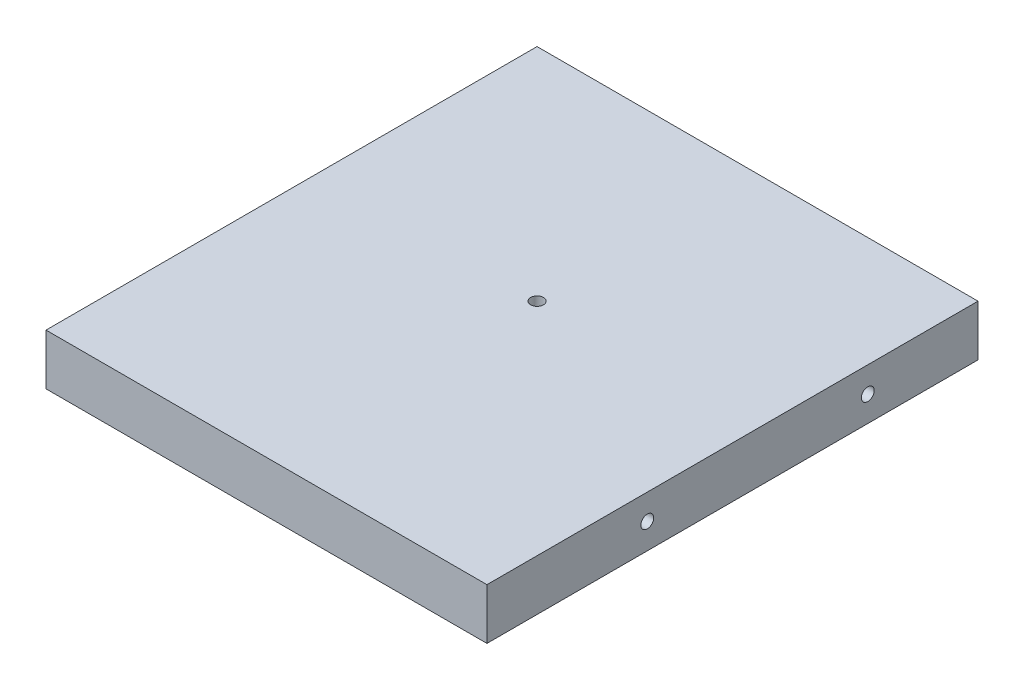
ISO-10303-21;
HEADER;
FILE_DESCRIPTION(('STEP AP214'),'2;1');
FILE_NAME('part.step','',(''),(''),'','','');
FILE_SCHEMA(('AUTOMOTIVE_DESIGN { 1 0 10303 214 1 1 1 1 }'));
ENDSEC;
DATA;
#1=APPLICATION_CONTEXT('core data for automotive mechanical design processes');
#2=APPLICATION_PROTOCOL_DEFINITION('international standard','automotive_design',2000,#1);
#3=PRODUCT_CONTEXT('',#1,'mechanical');
#4=PRODUCT('Part','Part','',(#3));
#5=PRODUCT_RELATED_PRODUCT_CATEGORY('part','',(#4));
#6=PRODUCT_DEFINITION_FORMATION('','',#4);
#7=PRODUCT_DEFINITION_CONTEXT('part definition',#1,'design');
#8=PRODUCT_DEFINITION('design','',#6,#7);
#9=PRODUCT_DEFINITION_SHAPE('','',#8);
#10=(LENGTH_UNIT() NAMED_UNIT(*) SI_UNIT(.MILLI.,.METRE.));
#11=(NAMED_UNIT(*) PLANE_ANGLE_UNIT() SI_UNIT($,.RADIAN.));
#12=(NAMED_UNIT(*) SI_UNIT($,.STERADIAN.) SOLID_ANGLE_UNIT());
#13=UNCERTAINTY_MEASURE_WITH_UNIT(LENGTH_MEASURE(1.E-05),#10,'distance_accuracy_value','');
#14=(GEOMETRIC_REPRESENTATION_CONTEXT(3) GLOBAL_UNCERTAINTY_ASSIGNED_CONTEXT((#13)) GLOBAL_UNIT_ASSIGNED_CONTEXT((#10,
#11,#12)) REPRESENTATION_CONTEXT('',''));
#15=CARTESIAN_POINT('',(0.,0.,0.));
#16=DIRECTION('',(0.,0.,1.));
#17=DIRECTION('',(1.,0.,0.));
#18=AXIS2_PLACEMENT_3D('',#15,#16,#17);
#19=CARTESIAN_POINT('',(61.7729043572606,25.4,-131.48104782137));
#20=DIRECTION('',(1.,0.,0.));
#21=DIRECTION('',(0.,0.,-1.));
#22=AXIS2_PLACEMENT_3D('',#19,#20,#21);
#23=PLANE('',#22);
#24=CARTESIAN_POINT('',(61.7729043572606,12.7,33.5189521786303));
#25=DIRECTION('',(-1.,0.,0.));
#26=DIRECTION('',(0.,0.,1.));
#27=AXIS2_PLACEMENT_3D('',#24,#25,#26);
#28=CIRCLE('',#27,3.2);
#29=CARTESIAN_POINT('',(61.7729043572606,12.7,36.7189521786303));
#30=VERTEX_POINT('',#29);
#31=EDGE_CURVE('E108',#30,#30,#28,.T.);
#32=ORIENTED_EDGE('',*,*,#31,.F.);
#33=EDGE_LOOP('',(#32));
#34=FACE_BOUND('',#33,.T.);
#35=CARTESIAN_POINT('',(61.7729043572606,12.7,-76.4810478213697));
#36=DIRECTION('',(-1.,0.,0.));
#37=DIRECTION('',(0.,0.,1.));
#38=AXIS2_PLACEMENT_3D('',#35,#36,#37);
#39=CIRCLE('',#38,3.2);
#40=CARTESIAN_POINT('',(61.7729043572606,12.7,-73.2810478213697));
#41=VERTEX_POINT('',#40);
#42=EDGE_CURVE('E114',#41,#41,#39,.T.);
#43=ORIENTED_EDGE('',*,*,#42,.F.);
#44=EDGE_LOOP('',(#43));
#45=FACE_BOUND('',#44,.T.);
#46=DIRECTION('',(0.,0.,1.));
#47=VECTOR('',#46,1.);
#48=CARTESIAN_POINT('',(61.7729043572606,0.,-131.48104782137));
#49=LINE('',#48,#47);
#50=CARTESIAN_POINT('',(61.7729043572606,0.,-131.48104782137));
#51=VERTEX_POINT('',#50);
#52=CARTESIAN_POINT('',(61.7729043572606,0.,113.51895217863));
#53=VERTEX_POINT('',#52);
#54=EDGE_CURVE('E77',#51,#53,#49,.T.);
#55=ORIENTED_EDGE('',*,*,#54,.T.);
#56=DIRECTION('',(0.,-1.,0.));
#57=VECTOR('',#56,1.);
#58=CARTESIAN_POINT('',(61.7729043572606,25.4,113.51895217863));
#59=LINE('',#58,#57);
#60=CARTESIAN_POINT('',(61.7729043572606,25.4,113.51895217863));
#61=VERTEX_POINT('',#60);
#62=EDGE_CURVE('E80',#61,#53,#59,.T.);
#63=ORIENTED_EDGE('',*,*,#62,.F.);
#64=DIRECTION('',(0.,0.,1.));
#65=VECTOR('',#64,1.);
#66=CARTESIAN_POINT('',(61.7729043572606,25.4,-131.48104782137));
#67=LINE('',#66,#65);
#68=CARTESIAN_POINT('',(61.7729043572606,25.4,-131.48104782137));
#69=VERTEX_POINT('',#68);
#70=EDGE_CURVE('E64',#69,#61,#67,.T.);
#71=ORIENTED_EDGE('',*,*,#70,.F.);
#72=DIRECTION('',(0.,-1.,0.));
#73=VECTOR('',#72,1.);
#74=CARTESIAN_POINT('',(61.7729043572606,25.4,-131.48104782137));
#75=LINE('',#74,#73);
#76=EDGE_CURVE('E40',#69,#51,#75,.T.);
#77=ORIENTED_EDGE('',*,*,#76,.T.);
#78=EDGE_LOOP('',(#55,#63,#71,#77));
#79=FACE_BOUND('',#78,.T.);
#80=ADVANCED_FACE('F32',(#34,#45,#79),#23,.F.);
#81=CARTESIAN_POINT('',(281.772904357261,25.4,-131.48104782137));
#82=DIRECTION('',(-1.,0.,0.));
#83=DIRECTION('',(0.,0.,1.));
#84=AXIS2_PLACEMENT_3D('',#81,#82,#83);
#85=PLANE('',#84);
#86=CARTESIAN_POINT('',(281.772904357261,12.7,-76.4810478213697));
#87=DIRECTION('',(1.,0.,0.));
#88=DIRECTION('',(0.,0.,-1.));
#89=AXIS2_PLACEMENT_3D('',#86,#87,#88);
#90=CIRCLE('',#89,3.2);
#91=CARTESIAN_POINT('',(281.772904357261,12.7,-79.6810478213697));
#92=VERTEX_POINT('',#91);
#93=EDGE_CURVE('E98',#92,#92,#90,.T.);
#94=ORIENTED_EDGE('',*,*,#93,.F.);
#95=EDGE_LOOP('',(#94));
#96=FACE_BOUND('',#95,.T.);
#97=CARTESIAN_POINT('',(281.772904357261,12.7,33.5189521786303));
#98=DIRECTION('',(1.,0.,0.));
#99=DIRECTION('',(0.,0.,-1.));
#100=AXIS2_PLACEMENT_3D('',#97,#98,#99);
#101=CIRCLE('',#100,3.2);
#102=CARTESIAN_POINT('',(281.772904357261,12.7,30.3189521786303));
#103=VERTEX_POINT('',#102);
#104=EDGE_CURVE('E102',#103,#103,#101,.T.);
#105=ORIENTED_EDGE('',*,*,#104,.F.);
#106=EDGE_LOOP('',(#105));
#107=FACE_BOUND('',#106,.T.);
#108=DIRECTION('',(0.,0.,-1.));
#109=VECTOR('',#108,1.);
#110=CARTESIAN_POINT('',(281.772904357261,0.,-131.48104782137));
#111=LINE('',#110,#109);
#112=CARTESIAN_POINT('',(281.772904357261,0.,113.51895217863));
#113=VERTEX_POINT('',#112);
#114=CARTESIAN_POINT('',(281.772904357261,0.,-131.48104782137));
#115=VERTEX_POINT('',#114);
#116=EDGE_CURVE('E59',#113,#115,#111,.T.);
#117=ORIENTED_EDGE('',*,*,#116,.T.);
#118=DIRECTION('',(0.,-1.,0.));
#119=VECTOR('',#118,1.);
#120=CARTESIAN_POINT('',(281.772904357261,25.4,-131.48104782137));
#121=LINE('',#120,#119);
#122=CARTESIAN_POINT('',(281.772904357261,25.4,-131.48104782137));
#123=VERTEX_POINT('',#122);
#124=EDGE_CURVE('E11',#123,#115,#121,.T.);
#125=ORIENTED_EDGE('',*,*,#124,.F.);
#126=DIRECTION('',(0.,0.,-1.));
#127=VECTOR('',#126,1.);
#128=CARTESIAN_POINT('',(281.772904357261,25.4,-131.48104782137));
#129=LINE('',#128,#127);
#130=CARTESIAN_POINT('',(281.772904357261,25.4,113.51895217863));
#131=VERTEX_POINT('',#130);
#132=EDGE_CURVE('E128',#131,#123,#129,.T.);
#133=ORIENTED_EDGE('',*,*,#132,.F.);
#134=DIRECTION('',(0.,1.,0.));
#135=VECTOR('',#134,1.);
#136=CARTESIAN_POINT('',(281.772904357261,25.4,113.51895217863));
#137=LINE('',#136,#135);
#138=EDGE_CURVE('E90',#113,#131,#137,.T.);
#139=ORIENTED_EDGE('',*,*,#138,.F.);
#140=EDGE_LOOP('',(#117,#125,#133,#139));
#141=FACE_BOUND('',#140,.T.);
#142=ADVANCED_FACE('F135',(#96,#107,#141),#85,.F.);
#143=CARTESIAN_POINT('',(61.7729043572606,25.4,-131.48104782137));
#144=DIRECTION('',(0.,0.,1.));
#145=DIRECTION('',(1.,0.,0.));
#146=AXIS2_PLACEMENT_3D('',#143,#144,#145);
#147=PLANE('',#146);
#148=DIRECTION('',(-1.,0.,0.));
#149=VECTOR('',#148,1.);
#150=CARTESIAN_POINT('',(61.7729043572606,0.,-131.48104782137));
#151=LINE('',#150,#149);
#152=EDGE_CURVE('E129',#115,#51,#151,.T.);
#153=ORIENTED_EDGE('',*,*,#152,.T.);
#154=ORIENTED_EDGE('',*,*,#76,.F.);
#155=DIRECTION('',(-1.,0.,0.));
#156=VECTOR('',#155,1.);
#157=CARTESIAN_POINT('',(61.7729043572606,25.4,-131.48104782137));
#158=LINE('',#157,#156);
#159=EDGE_CURVE('E48',#123,#69,#158,.T.);
#160=ORIENTED_EDGE('',*,*,#159,.F.);
#161=ORIENTED_EDGE('',*,*,#124,.T.);
#162=EDGE_LOOP('',(#153,#154,#160,#161));
#163=FACE_BOUND('',#162,.T.);
#164=ADVANCED_FACE('F134',(#163),#147,.F.);
#165=CARTESIAN_POINT('',(0.,25.4,0.));
#166=DIRECTION('',(0.,1.,0.));
#167=DIRECTION('',(0.,0.,1.));
#168=AXIS2_PLACEMENT_3D('',#165,#166,#167);
#169=PLANE('',#168);
#170=CARTESIAN_POINT('',(171.772904357261,25.4,-21.4810478213697));
#171=DIRECTION('',(0.,1.,0.));
#172=DIRECTION('',(0.,0.,1.));
#173=AXIS2_PLACEMENT_3D('',#170,#171,#172);
#174=CIRCLE('',#173,3.20000000000001);
#175=CARTESIAN_POINT('',(171.772904357261,25.4,-18.2810478213697));
#176=VERTEX_POINT('',#175);
#177=EDGE_CURVE('E120',#176,#176,#174,.T.);
#178=ORIENTED_EDGE('',*,*,#177,.F.);
#179=EDGE_LOOP('',(#178));
#180=FACE_BOUND('',#179,.T.);
#181=ORIENTED_EDGE('',*,*,#70,.T.);
#182=DIRECTION('',(-1.,0.,0.));
#183=VECTOR('',#182,1.);
#184=CARTESIAN_POINT('',(61.7729043572606,25.4,113.51895217863));
#185=LINE('',#184,#183);
#186=EDGE_CURVE('E93',#131,#61,#185,.T.);
#187=ORIENTED_EDGE('',*,*,#186,.F.);
#188=ORIENTED_EDGE('',*,*,#132,.T.);
#189=ORIENTED_EDGE('',*,*,#159,.T.);
#190=EDGE_LOOP('',(#181,#187,#188,#189));
#191=FACE_BOUND('',#190,.T.);
#192=ADVANCED_FACE('F136',(#180,#191),#169,.T.);
#193=CARTESIAN_POINT('',(0.,0.,0.));
#194=DIRECTION('',(0.,1.,0.));
#195=DIRECTION('',(0.,0.,1.));
#196=AXIS2_PLACEMENT_3D('',#193,#194,#195);
#197=PLANE('',#196);
#198=CARTESIAN_POINT('',(171.772904357261,0.,-21.4810478213697));
#199=DIRECTION('',(0.,1.,0.));
#200=DIRECTION('',(0.,0.,1.));
#201=AXIS2_PLACEMENT_3D('',#198,#199,#200);
#202=CIRCLE('',#201,3.20000000000001);
#203=CARTESIAN_POINT('',(171.772904357261,0.,-18.2810478213697));
#204=VERTEX_POINT('',#203);
#205=EDGE_CURVE('E83',#204,#204,#202,.T.);
#206=ORIENTED_EDGE('',*,*,#205,.T.);
#207=EDGE_LOOP('',(#206));
#208=FACE_BOUND('',#207,.T.);
#209=ORIENTED_EDGE('',*,*,#54,.F.);
#210=ORIENTED_EDGE('',*,*,#152,.F.);
#211=ORIENTED_EDGE('',*,*,#116,.F.);
#212=DIRECTION('',(1.,0.,0.));
#213=VECTOR('',#212,1.);
#214=CARTESIAN_POINT('',(61.7729043572606,0.,113.51895217863));
#215=LINE('',#214,#213);
#216=EDGE_CURVE('E86',#53,#113,#215,.T.);
#217=ORIENTED_EDGE('',*,*,#216,.F.);
#218=EDGE_LOOP('',(#209,#210,#211,#217));
#219=FACE_BOUND('',#218,.T.);
#220=ADVANCED_FACE('F87',(#208,#219),#197,.F.);
#221=CARTESIAN_POINT('',(171.772904357261,0.,-21.4810478213697));
#222=DIRECTION('',(0.,1.,0.));
#223=DIRECTION('',(0.,0.,1.));
#224=AXIS2_PLACEMENT_3D('',#221,#222,#223);
#225=CYLINDRICAL_SURFACE('',#224,3.20000000000001);
#226=ORIENTED_EDGE('',*,*,#205,.F.);
#227=EDGE_LOOP('',(#226));
#228=FACE_BOUND('',#227,.T.);
#229=ORIENTED_EDGE('',*,*,#177,.T.);
#230=EDGE_LOOP('',(#229));
#231=FACE_BOUND('',#230,.T.);
#232=ADVANCED_FACE('F144',(#228,#231),#225,.F.);
#233=CARTESIAN_POINT('',(91.7729043572606,12.7,-76.4810478213697));
#234=DIRECTION('',(-1.,0.,0.));
#235=DIRECTION('',(0.,0.,1.));
#236=AXIS2_PLACEMENT_3D('',#233,#234,#235);
#237=CYLINDRICAL_SURFACE('',#236,3.2);
#238=CARTESIAN_POINT('',(91.7729043572606,12.7,-76.4810478213697));
#239=DIRECTION('',(-1.,0.,0.));
#240=DIRECTION('',(0.,0.,1.));
#241=AXIS2_PLACEMENT_3D('',#238,#239,#240);
#242=CIRCLE('',#241,3.2);
#243=CARTESIAN_POINT('',(91.7729043572606,12.7,-73.2810478213697));
#244=VERTEX_POINT('',#243);
#245=EDGE_CURVE('E117',#244,#244,#242,.T.);
#246=ORIENTED_EDGE('',*,*,#245,.F.);
#247=EDGE_LOOP('',(#246));
#248=FACE_BOUND('',#247,.T.);
#249=ORIENTED_EDGE('',*,*,#42,.T.);
#250=EDGE_LOOP('',(#249));
#251=FACE_BOUND('',#250,.T.);
#252=ADVANCED_FACE('F161',(#248,#251),#237,.F.);
#253=CARTESIAN_POINT('',(91.7729043572606,12.7,-76.4810478213697));
#254=DIRECTION('',(-1.,0.,0.));
#255=DIRECTION('',(0.,0.,1.));
#256=AXIS2_PLACEMENT_3D('',#253,#254,#255);
#257=PLANE('',#256);
#258=ORIENTED_EDGE('',*,*,#245,.T.);
#259=EDGE_LOOP('',(#258));
#260=FACE_BOUND('',#259,.T.);
#261=ADVANCED_FACE('F163',(#260),#257,.T.);
#262=CARTESIAN_POINT('',(91.7729043572606,12.7,33.5189521786303));
#263=DIRECTION('',(-1.,0.,0.));
#264=DIRECTION('',(0.,0.,1.));
#265=AXIS2_PLACEMENT_3D('',#262,#263,#264);
#266=CYLINDRICAL_SURFACE('',#265,3.2);
#267=CARTESIAN_POINT('',(91.7729043572606,12.7,33.5189521786303));
#268=DIRECTION('',(-1.,0.,0.));
#269=DIRECTION('',(0.,0.,1.));
#270=AXIS2_PLACEMENT_3D('',#267,#268,#269);
#271=CIRCLE('',#270,3.2);
#272=CARTESIAN_POINT('',(91.7729043572606,12.7,36.7189521786303));
#273=VERTEX_POINT('',#272);
#274=EDGE_CURVE('E111',#273,#273,#271,.T.);
#275=ORIENTED_EDGE('',*,*,#274,.F.);
#276=EDGE_LOOP('',(#275));
#277=FACE_BOUND('',#276,.T.);
#278=ORIENTED_EDGE('',*,*,#31,.T.);
#279=EDGE_LOOP('',(#278));
#280=FACE_BOUND('',#279,.T.);
#281=ADVANCED_FACE('F169',(#277,#280),#266,.F.);
#282=CARTESIAN_POINT('',(91.7729043572606,12.7,33.5189521786303));
#283=DIRECTION('',(-1.,0.,0.));
#284=DIRECTION('',(0.,0.,1.));
#285=AXIS2_PLACEMENT_3D('',#282,#283,#284);
#286=PLANE('',#285);
#287=ORIENTED_EDGE('',*,*,#274,.T.);
#288=EDGE_LOOP('',(#287));
#289=FACE_BOUND('',#288,.T.);
#290=ADVANCED_FACE('F177',(#289),#286,.T.);
#291=CARTESIAN_POINT('',(251.772904357261,12.7,33.5189521786303));
#292=DIRECTION('',(1.,0.,0.));
#293=DIRECTION('',(0.,0.,-1.));
#294=AXIS2_PLACEMENT_3D('',#291,#292,#293);
#295=CYLINDRICAL_SURFACE('',#294,3.2);
#296=CARTESIAN_POINT('',(251.772904357261,12.7,33.5189521786303));
#297=DIRECTION('',(1.,0.,0.));
#298=DIRECTION('',(0.,0.,-1.));
#299=AXIS2_PLACEMENT_3D('',#296,#297,#298);
#300=CIRCLE('',#299,3.2);
#301=CARTESIAN_POINT('',(251.772904357261,12.7,30.3189521786303));
#302=VERTEX_POINT('',#301);
#303=EDGE_CURVE('E105',#302,#302,#300,.T.);
#304=ORIENTED_EDGE('',*,*,#303,.F.);
#305=EDGE_LOOP('',(#304));
#306=FACE_BOUND('',#305,.T.);
#307=ORIENTED_EDGE('',*,*,#104,.T.);
#308=EDGE_LOOP('',(#307));
#309=FACE_BOUND('',#308,.T.);
#310=ADVANCED_FACE('F181',(#306,#309),#295,.F.);
#311=CARTESIAN_POINT('',(251.772904357261,12.7,33.5189521786303));
#312=DIRECTION('',(1.,0.,0.));
#313=DIRECTION('',(0.,0.,-1.));
#314=AXIS2_PLACEMENT_3D('',#311,#312,#313);
#315=PLANE('',#314);
#316=ORIENTED_EDGE('',*,*,#303,.T.);
#317=EDGE_LOOP('',(#316));
#318=FACE_BOUND('',#317,.T.);
#319=ADVANCED_FACE('F185',(#318),#315,.T.);
#320=CARTESIAN_POINT('',(251.772904357261,12.7,-76.4810478213697));
#321=DIRECTION('',(1.,0.,0.));
#322=DIRECTION('',(0.,0.,-1.));
#323=AXIS2_PLACEMENT_3D('',#320,#321,#322);
#324=CYLINDRICAL_SURFACE('',#323,3.2);
#325=CARTESIAN_POINT('',(251.772904357261,12.7,-76.4810478213697));
#326=DIRECTION('',(1.,0.,0.));
#327=DIRECTION('',(0.,0.,-1.));
#328=AXIS2_PLACEMENT_3D('',#325,#326,#327);
#329=CIRCLE('',#328,3.2);
#330=CARTESIAN_POINT('',(251.772904357261,12.7,-79.6810478213697));
#331=VERTEX_POINT('',#330);
#332=EDGE_CURVE('E99',#331,#331,#329,.T.);
#333=ORIENTED_EDGE('',*,*,#332,.F.);
#334=EDGE_LOOP('',(#333));
#335=FACE_BOUND('',#334,.T.);
#336=ORIENTED_EDGE('',*,*,#93,.T.);
#337=EDGE_LOOP('',(#336));
#338=FACE_BOUND('',#337,.T.);
#339=ADVANCED_FACE('F189',(#335,#338),#324,.F.);
#340=CARTESIAN_POINT('',(251.772904357261,12.7,-76.4810478213697));
#341=DIRECTION('',(1.,0.,0.));
#342=DIRECTION('',(0.,0.,-1.));
#343=AXIS2_PLACEMENT_3D('',#340,#341,#342);
#344=PLANE('',#343);
#345=ORIENTED_EDGE('',*,*,#332,.T.);
#346=EDGE_LOOP('',(#345));
#347=FACE_BOUND('',#346,.T.);
#348=ADVANCED_FACE('F193',(#347),#344,.T.);
#349=CARTESIAN_POINT('',(0.,0.,113.51895217863));
#350=DIRECTION('',(0.,0.,1.));
#351=DIRECTION('',(1.,0.,0.));
#352=AXIS2_PLACEMENT_3D('',#349,#350,#351);
#353=PLANE('',#352);
#354=ORIENTED_EDGE('',*,*,#62,.T.);
#355=ORIENTED_EDGE('',*,*,#216,.T.);
#356=ORIENTED_EDGE('',*,*,#138,.T.);
#357=ORIENTED_EDGE('',*,*,#186,.T.);
#358=EDGE_LOOP('',(#354,#355,#356,#357));
#359=FACE_BOUND('',#358,.T.);
#360=ADVANCED_FACE('F92',(#359),#353,.T.);
#361=CLOSED_SHELL('',(#80,#142,#164,#192,#220,#232,#252,#261,#281,#290,#310,#319,#339,#348,#360));
#362=MANIFOLD_SOLID_BREP('B2',#361);
#363=ADVANCED_BREP_SHAPE_REPRESENTATION('',(#18,#362),#14);
#364=SHAPE_DEFINITION_REPRESENTATION(#9,#363);
ENDSEC;
END-ISO-10303-21;
